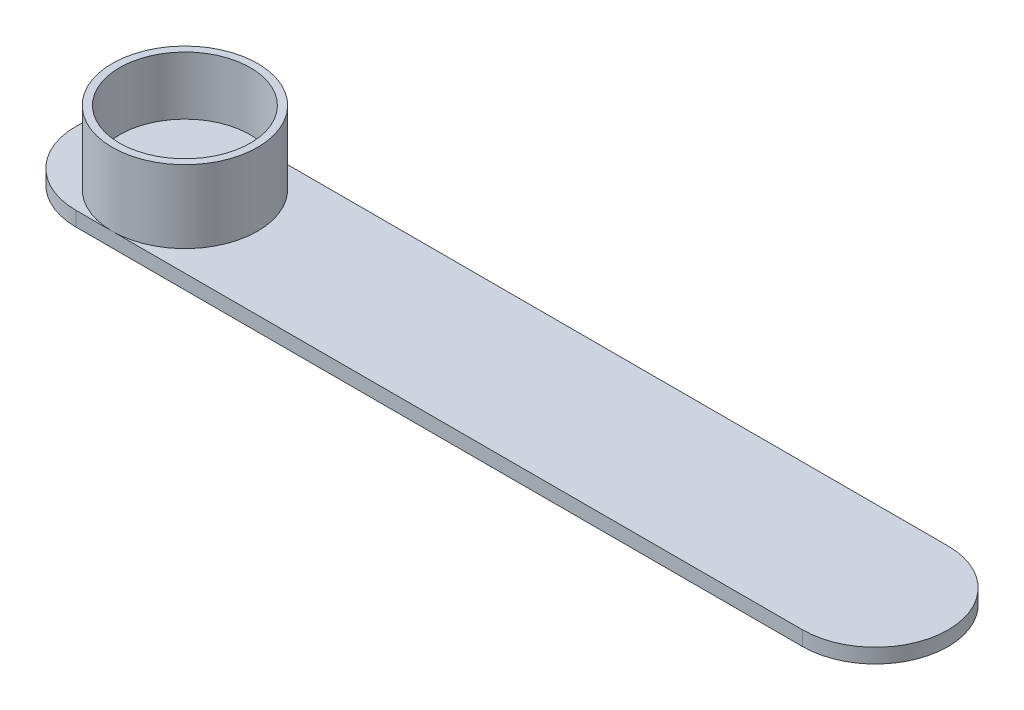
ISO-10303-21;
HEADER;
FILE_DESCRIPTION(('STEP AP214'),'2;1');
FILE_NAME('part.step','',(''),(''),'','','');
FILE_SCHEMA(('AUTOMOTIVE_DESIGN { 1 0 10303 214 1 1 1 1 }'));
ENDSEC;
DATA;
#1=APPLICATION_CONTEXT('core data for automotive mechanical design processes');
#2=APPLICATION_PROTOCOL_DEFINITION('international standard','automotive_design',2000,#1);
#3=PRODUCT_CONTEXT('',#1,'mechanical');
#4=PRODUCT('Part','Part','',(#3));
#5=PRODUCT_RELATED_PRODUCT_CATEGORY('part','',(#4));
#6=PRODUCT_DEFINITION_FORMATION('','',#4);
#7=PRODUCT_DEFINITION_CONTEXT('part definition',#1,'design');
#8=PRODUCT_DEFINITION('design','',#6,#7);
#9=PRODUCT_DEFINITION_SHAPE('','',#8);
#10=(LENGTH_UNIT() NAMED_UNIT(*) SI_UNIT(.MILLI.,.METRE.));
#11=(NAMED_UNIT(*) PLANE_ANGLE_UNIT() SI_UNIT($,.RADIAN.));
#12=(NAMED_UNIT(*) SI_UNIT($,.STERADIAN.) SOLID_ANGLE_UNIT());
#13=UNCERTAINTY_MEASURE_WITH_UNIT(LENGTH_MEASURE(1.E-05),#10,'distance_accuracy_value','');
#14=(GEOMETRIC_REPRESENTATION_CONTEXT(3) GLOBAL_UNCERTAINTY_ASSIGNED_CONTEXT((#13)) GLOBAL_UNIT_ASSIGNED_CONTEXT((#10,
#11,#12)) REPRESENTATION_CONTEXT('',''));
#15=CARTESIAN_POINT('',(0.,0.,0.));
#16=DIRECTION('',(0.,0.,1.));
#17=DIRECTION('',(1.,0.,0.));
#18=AXIS2_PLACEMENT_3D('',#15,#16,#17);
#19=CARTESIAN_POINT('',(70.,2.,0.));
#20=DIRECTION('',(0.,1.,0.));
#21=DIRECTION('',(0.,0.,1.));
#22=AXIS2_PLACEMENT_3D('',#19,#20,#21);
#23=PLANE('',#22);
#24=CARTESIAN_POINT('',(-25.,2.,0.));
#25=DIRECTION('',(0.,1.,0.));
#26=DIRECTION('',(0.,0.,1.));
#27=AXIS2_PLACEMENT_3D('',#24,#25,#26);
#28=CIRCLE('',#27,10.);
#29=CARTESIAN_POINT('',(-25.,2.,10.));
#30=VERTEX_POINT('',#29);
#31=CARTESIAN_POINT('',(-25.,2.,-10.));
#32=VERTEX_POINT('',#31);
#33=EDGE_CURVE('E45',#30,#32,#28,.T.);
#34=ORIENTED_EDGE('',*,*,#33,.F.);
#35=DIRECTION('',(1.,0.,0.));
#36=VECTOR('',#35,1.);
#37=CARTESIAN_POINT('',(-30.,2.,10.));
#38=LINE('',#37,#36);
#39=CARTESIAN_POINT('',(70.,2.,10.));
#40=VERTEX_POINT('',#39);
#41=EDGE_CURVE('E59',#30,#40,#38,.T.);
#42=ORIENTED_EDGE('',*,*,#41,.T.);
#43=CARTESIAN_POINT('',(70.,2.,0.));
#44=DIRECTION('',(0.,1.,0.));
#45=DIRECTION('',(0.,0.,1.));
#46=AXIS2_PLACEMENT_3D('',#43,#44,#45);
#47=CIRCLE('',#46,10.);
#48=CARTESIAN_POINT('',(70.,2.,-10.));
#49=VERTEX_POINT('',#48);
#50=EDGE_CURVE('E157',#40,#49,#47,.T.);
#51=ORIENTED_EDGE('',*,*,#50,.T.);
#52=DIRECTION('',(-1.,0.,0.));
#53=VECTOR('',#52,1.);
#54=CARTESIAN_POINT('',(-30.,2.,-10.));
#55=LINE('',#54,#53);
#56=EDGE_CURVE('E88',#49,#32,#55,.T.);
#57=ORIENTED_EDGE('',*,*,#56,.T.);
#58=EDGE_LOOP('',(#34,#42,#51,#57));
#59=FACE_BOUND('',#58,.T.);
#60=ADVANCED_FACE('F35',(#59),#23,.T.);
#61=CARTESIAN_POINT('',(70.,2.,0.));
#62=DIRECTION('',(0.,-1.,0.));
#63=DIRECTION('',(0.,0.,-1.));
#64=AXIS2_PLACEMENT_3D('',#61,#62,#63);
#65=CYLINDRICAL_SURFACE('',#64,10.);
#66=CARTESIAN_POINT('',(70.,0.,0.));
#67=DIRECTION('',(0.,1.,0.));
#68=DIRECTION('',(0.,0.,1.));
#69=AXIS2_PLACEMENT_3D('',#66,#67,#68);
#70=CIRCLE('',#69,10.);
#71=CARTESIAN_POINT('',(70.,0.,10.));
#72=VERTEX_POINT('',#71);
#73=CARTESIAN_POINT('',(70.,0.,-10.));
#74=VERTEX_POINT('',#73);
#75=EDGE_CURVE('E153',#72,#74,#70,.T.);
#76=ORIENTED_EDGE('',*,*,#75,.T.);
#77=DIRECTION('',(0.,-1.,0.));
#78=VECTOR('',#77,1.);
#79=CARTESIAN_POINT('',(70.,2.,-10.));
#80=LINE('',#79,#78);
#81=EDGE_CURVE('E39',#49,#74,#80,.T.);
#82=ORIENTED_EDGE('',*,*,#81,.F.);
#83=ORIENTED_EDGE('',*,*,#50,.F.);
#84=DIRECTION('',(0.,-1.,0.));
#85=VECTOR('',#84,1.);
#86=CARTESIAN_POINT('',(70.,2.,10.));
#87=LINE('',#86,#85);
#88=EDGE_CURVE('E96',#40,#72,#87,.T.);
#89=ORIENTED_EDGE('',*,*,#88,.T.);
#90=EDGE_LOOP('',(#76,#82,#83,#89));
#91=FACE_BOUND('',#90,.T.);
#92=ADVANCED_FACE('F37',(#91),#65,.T.);
#93=CARTESIAN_POINT('',(-30.,2.,-10.));
#94=DIRECTION('',(0.,0.,1.));
#95=DIRECTION('',(1.,0.,0.));
#96=AXIS2_PLACEMENT_3D('',#93,#94,#95);
#97=PLANE('',#96);
#98=DIRECTION('',(-1.,0.,0.));
#99=VECTOR('',#98,1.);
#100=CARTESIAN_POINT('',(-30.,0.,-10.));
#101=LINE('',#100,#99);
#102=CARTESIAN_POINT('',(-30.,0.,-10.));
#103=VERTEX_POINT('',#102);
#104=EDGE_CURVE('E145',#74,#103,#101,.T.);
#105=ORIENTED_EDGE('',*,*,#104,.T.);
#106=DIRECTION('',(0.,-1.,0.));
#107=VECTOR('',#106,1.);
#108=CARTESIAN_POINT('',(-30.,2.,-10.));
#109=LINE('',#108,#107);
#110=CARTESIAN_POINT('',(-30.,2.,-10.));
#111=VERTEX_POINT('',#110);
#112=EDGE_CURVE('E147',#111,#103,#109,.T.);
#113=ORIENTED_EDGE('',*,*,#112,.F.);
#114=EDGE_CURVE('E167',#32,#111,#55,.T.);
#115=ORIENTED_EDGE('',*,*,#114,.F.);
#116=ORIENTED_EDGE('',*,*,#56,.F.);
#117=ORIENTED_EDGE('',*,*,#81,.T.);
#118=EDGE_LOOP('',(#105,#113,#115,#116,#117));
#119=FACE_BOUND('',#118,.T.);
#120=ADVANCED_FACE('F128',(#119),#97,.F.);
#121=CARTESIAN_POINT('',(-30.,2.,0.));
#122=DIRECTION('',(0.,-1.,0.));
#123=DIRECTION('',(0.,0.,-1.));
#124=AXIS2_PLACEMENT_3D('',#121,#122,#123);
#125=CYLINDRICAL_SURFACE('',#124,10.);
#126=CARTESIAN_POINT('',(-30.,0.,0.));
#127=DIRECTION('',(0.,1.,0.));
#128=DIRECTION('',(0.,0.,1.));
#129=AXIS2_PLACEMENT_3D('',#126,#127,#128);
#130=CIRCLE('',#129,10.);
#131=CARTESIAN_POINT('',(-30.,0.,10.));
#132=VERTEX_POINT('',#131);
#133=EDGE_CURVE('E152',#103,#132,#130,.T.);
#134=ORIENTED_EDGE('',*,*,#133,.T.);
#135=DIRECTION('',(0.,-1.,0.));
#136=VECTOR('',#135,1.);
#137=CARTESIAN_POINT('',(-30.,2.,10.));
#138=LINE('',#137,#136);
#139=CARTESIAN_POINT('',(-30.,2.,10.));
#140=VERTEX_POINT('',#139);
#141=EDGE_CURVE('E155',#140,#132,#138,.T.);
#142=ORIENTED_EDGE('',*,*,#141,.F.);
#143=CARTESIAN_POINT('',(-30.,2.,0.));
#144=DIRECTION('',(0.,1.,0.));
#145=DIRECTION('',(0.,0.,1.));
#146=AXIS2_PLACEMENT_3D('',#143,#144,#145);
#147=CIRCLE('',#146,10.);
#148=EDGE_CURVE('E94',#111,#140,#147,.T.);
#149=ORIENTED_EDGE('',*,*,#148,.F.);
#150=ORIENTED_EDGE('',*,*,#112,.T.);
#151=EDGE_LOOP('',(#134,#142,#149,#150));
#152=FACE_BOUND('',#151,.T.);
#153=ADVANCED_FACE('F135',(#152),#125,.T.);
#154=CARTESIAN_POINT('',(-30.,2.,10.));
#155=DIRECTION('',(0.,0.,-1.));
#156=DIRECTION('',(-1.,0.,0.));
#157=AXIS2_PLACEMENT_3D('',#154,#155,#156);
#158=PLANE('',#157);
#159=DIRECTION('',(1.,0.,0.));
#160=VECTOR('',#159,1.);
#161=CARTESIAN_POINT('',(-30.,0.,10.));
#162=LINE('',#161,#160);
#163=EDGE_CURVE('E81',#132,#72,#162,.T.);
#164=ORIENTED_EDGE('',*,*,#163,.T.);
#165=ORIENTED_EDGE('',*,*,#88,.F.);
#166=ORIENTED_EDGE('',*,*,#41,.F.);
#167=EDGE_CURVE('E91',#140,#30,#38,.T.);
#168=ORIENTED_EDGE('',*,*,#167,.F.);
#169=ORIENTED_EDGE('',*,*,#141,.T.);
#170=EDGE_LOOP('',(#164,#165,#166,#168,#169));
#171=FACE_BOUND('',#170,.T.);
#172=ADVANCED_FACE('F98',(#171),#158,.F.);
#173=EDGE_CURVE('E11',#32,#30,#28,.T.);
#174=ORIENTED_EDGE('',*,*,#173,.F.);
#175=ORIENTED_EDGE('',*,*,#114,.T.);
#176=ORIENTED_EDGE('',*,*,#148,.T.);
#177=ORIENTED_EDGE('',*,*,#167,.T.);
#178=EDGE_LOOP('',(#174,#175,#176,#177));
#179=FACE_BOUND('',#178,.T.);
#180=ADVANCED_FACE('F92',(#179),#23,.T.);
#181=CARTESIAN_POINT('',(70.,0.,0.));
#182=DIRECTION('',(0.,1.,0.));
#183=DIRECTION('',(0.,0.,1.));
#184=AXIS2_PLACEMENT_3D('',#181,#182,#183);
#185=PLANE('',#184);
#186=ORIENTED_EDGE('',*,*,#75,.F.);
#187=ORIENTED_EDGE('',*,*,#163,.F.);
#188=ORIENTED_EDGE('',*,*,#133,.F.);
#189=ORIENTED_EDGE('',*,*,#104,.F.);
#190=EDGE_LOOP('',(#186,#187,#188,#189));
#191=FACE_BOUND('',#190,.T.);
#192=ADVANCED_FACE('F107',(#191),#185,.F.);
#193=CARTESIAN_POINT('',(-25.,12.,0.));
#194=DIRECTION('',(0.,-1.,0.));
#195=DIRECTION('',(0.,0.,-1.));
#196=AXIS2_PLACEMENT_3D('',#193,#194,#195);
#197=CYLINDRICAL_SURFACE('',#196,10.);
#198=CARTESIAN_POINT('',(-25.,12.,0.));
#199=DIRECTION('',(0.,1.,0.));
#200=DIRECTION('',(0.,0.,1.));
#201=AXIS2_PLACEMENT_3D('',#198,#199,#200);
#202=CIRCLE('',#201,10.);
#203=CARTESIAN_POINT('',(-25.,12.,10.));
#204=VERTEX_POINT('',#203);
#205=EDGE_CURVE('E102',#204,#204,#202,.T.);
#206=ORIENTED_EDGE('',*,*,#205,.F.);
#207=EDGE_LOOP('',(#206));
#208=FACE_BOUND('',#207,.T.);
#209=ORIENTED_EDGE('',*,*,#33,.T.);
#210=ORIENTED_EDGE('',*,*,#173,.T.);
#211=EDGE_LOOP('',(#209,#210));
#212=FACE_BOUND('',#211,.T.);
#213=ADVANCED_FACE('F104',(#208,#212),#197,.T.);
#214=CARTESIAN_POINT('',(-25.,12.,0.));
#215=DIRECTION('',(0.,1.,0.));
#216=DIRECTION('',(0.,0.,1.));
#217=AXIS2_PLACEMENT_3D('',#214,#215,#216);
#218=PLANE('',#217);
#219=CARTESIAN_POINT('',(-25.,12.,0.));
#220=DIRECTION('',(0.,1.,0.));
#221=DIRECTION('',(0.,0.,1.));
#222=AXIS2_PLACEMENT_3D('',#219,#220,#221);
#223=CIRCLE('',#222,9.00000000000001);
#224=CARTESIAN_POINT('',(-25.,12.,9.00000000000001));
#225=VERTEX_POINT('',#224);
#226=EDGE_CURVE('E169',#225,#225,#223,.T.);
#227=ORIENTED_EDGE('',*,*,#226,.F.);
#228=EDGE_LOOP('',(#227));
#229=FACE_BOUND('',#228,.T.);
#230=ORIENTED_EDGE('',*,*,#205,.T.);
#231=EDGE_LOOP('',(#230));
#232=FACE_BOUND('',#231,.T.);
#233=ADVANCED_FACE('F106',(#229,#232),#218,.T.);
#234=CARTESIAN_POINT('',(-25.,4.,0.));
#235=DIRECTION('',(0.,1.,0.));
#236=DIRECTION('',(0.,0.,1.));
#237=AXIS2_PLACEMENT_3D('',#234,#235,#236);
#238=CYLINDRICAL_SURFACE('',#237,9.00000000000001);
#239=CARTESIAN_POINT('',(-25.,4.,0.));
#240=DIRECTION('',(0.,1.,0.));
#241=DIRECTION('',(0.,0.,1.));
#242=AXIS2_PLACEMENT_3D('',#239,#240,#241);
#243=CIRCLE('',#242,9.00000000000001);
#244=CARTESIAN_POINT('',(-25.,4.,9.00000000000001));
#245=VERTEX_POINT('',#244);
#246=EDGE_CURVE('E103',#245,#245,#243,.T.);
#247=ORIENTED_EDGE('',*,*,#246,.F.);
#248=EDGE_LOOP('',(#247));
#249=FACE_BOUND('',#248,.T.);
#250=ORIENTED_EDGE('',*,*,#226,.T.);
#251=EDGE_LOOP('',(#250));
#252=FACE_BOUND('',#251,.T.);
#253=ADVANCED_FACE('F114',(#249,#252),#238,.F.);
#254=CARTESIAN_POINT('',(-25.,4.,0.));
#255=DIRECTION('',(0.,1.,0.));
#256=DIRECTION('',(0.,0.,1.));
#257=AXIS2_PLACEMENT_3D('',#254,#255,#256);
#258=PLANE('',#257);
#259=ORIENTED_EDGE('',*,*,#246,.T.);
#260=EDGE_LOOP('',(#259));
#261=FACE_BOUND('',#260,.T.);
#262=ADVANCED_FACE('F175',(#261),#258,.T.);
#263=CLOSED_SHELL('',(#60,#92,#120,#153,#172,#180,#192,#213,#233,#253,#262));
#264=MANIFOLD_SOLID_BREP('B2',#263);
#265=ADVANCED_BREP_SHAPE_REPRESENTATION('',(#18,#264),#14);
#266=SHAPE_DEFINITION_REPRESENTATION(#9,#265);
ENDSEC;
END-ISO-10303-21;
